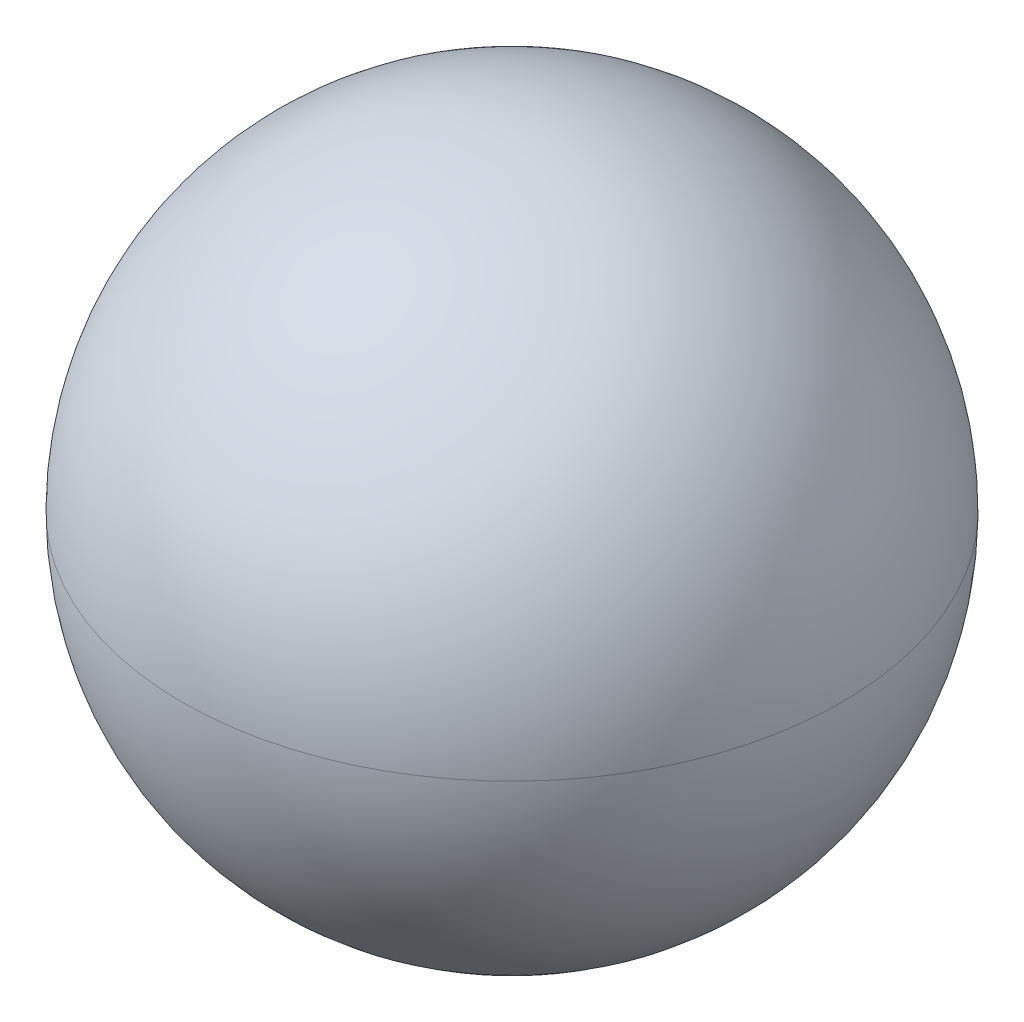
ISO-10303-21;
HEADER;
FILE_DESCRIPTION(('STEP AP214'),'2;1');
FILE_NAME('part.step','',(''),(''),'','','');
FILE_SCHEMA(('AUTOMOTIVE_DESIGN { 1 0 10303 214 1 1 1 1 }'));
ENDSEC;
DATA;
#1=APPLICATION_CONTEXT('core data for automotive mechanical design processes');
#2=APPLICATION_PROTOCOL_DEFINITION('international standard','automotive_design',2000,#1);
#3=PRODUCT_CONTEXT('',#1,'mechanical');
#4=PRODUCT('Part','Part','',(#3));
#5=PRODUCT_RELATED_PRODUCT_CATEGORY('part','',(#4));
#6=PRODUCT_DEFINITION_FORMATION('','',#4);
#7=PRODUCT_DEFINITION_CONTEXT('part definition',#1,'design');
#8=PRODUCT_DEFINITION('design','',#6,#7);
#9=PRODUCT_DEFINITION_SHAPE('','',#8);
#10=(LENGTH_UNIT() NAMED_UNIT(*) SI_UNIT(.MILLI.,.METRE.));
#11=(NAMED_UNIT(*) PLANE_ANGLE_UNIT() SI_UNIT($,.RADIAN.));
#12=(NAMED_UNIT(*) SI_UNIT($,.STERADIAN.) SOLID_ANGLE_UNIT());
#13=UNCERTAINTY_MEASURE_WITH_UNIT(LENGTH_MEASURE(1.E-05),#10,'distance_accuracy_value','');
#14=(GEOMETRIC_REPRESENTATION_CONTEXT(3) GLOBAL_UNCERTAINTY_ASSIGNED_CONTEXT((#13)) GLOBAL_UNIT_ASSIGNED_CONTEXT((#10,
#11,#12)) REPRESENTATION_CONTEXT('',''));
#15=CARTESIAN_POINT('',(0.,0.,0.));
#16=DIRECTION('',(0.,0.,1.));
#17=DIRECTION('',(1.,0.,0.));
#18=AXIS2_PLACEMENT_3D('',#15,#16,#17);
#19=CARTESIAN_POINT('',(0.,0.,0.));
#20=DIRECTION('',(0.,1.,0.));
#21=DIRECTION('',(0.,0.,1.));
#22=AXIS2_PLACEMENT_3D('',#19,#20,#21);
#23=PLANE('',#22);
#24=CARTESIAN_POINT('',(0.,0.,0.));
#25=DIRECTION('',(0.,1.,0.));
#26=DIRECTION('',(0.,0.,1.));
#27=AXIS2_PLACEMENT_3D('',#24,#25,#26);
#28=CIRCLE('',#27,6.13502705300133E-05);
#29=CARTESIAN_POINT('',(0.,0.,6.13502705300133E-05));
#30=VERTEX_POINT('',#29);
#31=EDGE_CURVE('E10',#30,#30,#28,.F.);
#32=ORIENTED_EDGE('',*,*,#31,.T.);
#33=EDGE_LOOP('',(#32));
#34=FACE_BOUND('',#33,.T.);
#35=ADVANCED_FACE('F31',(#34),#23,.F.);
#36=CARTESIAN_POINT('',(0.,3.24,0.));
#37=DIRECTION('',(0.,1.,0.));
#38=DIRECTION('',(0.,0.,1.));
#39=AXIS2_PLACEMENT_3D('',#36,#37,#38);
#40=SPHERICAL_SURFACE('',#39,3.26);
#41=CARTESIAN_POINT('',(0.,3.24,0.));
#42=DIRECTION('',(0.,-1.,0.));
#43=DIRECTION('',(0.,0.,-1.));
#44=AXIS2_PLACEMENT_3D('',#41,#42,#43);
#45=CIRCLE('',#44,3.26);
#46=CARTESIAN_POINT('',(0.,3.24,-3.26));
#47=VERTEX_POINT('',#46);
#48=EDGE_CURVE('E38',#47,#47,#45,.T.);
#49=ORIENTED_EDGE('',*,*,#48,.F.);
#50=EDGE_LOOP('',(#49));
#51=FACE_BOUND('',#50,.T.);
#52=ADVANCED_FACE('F45',(#51),#40,.T.);
#53=CARTESIAN_POINT('',(0.,3.26,0.));
#54=DIRECTION('',(0.,-1.,0.));
#55=DIRECTION('',(0.,0.,-1.));
#56=AXIS2_PLACEMENT_3D('',#53,#54,#55);
#57=DEGENERATE_TOROIDAL_SURFACE('',#56,6.13502705300133E-05,3.26,.T.);
#58=ORIENTED_EDGE('',*,*,#31,.F.);
#59=EDGE_LOOP('',(#58));
#60=FACE_BOUND('',#59,.T.);
#61=ORIENTED_EDGE('',*,*,#48,.T.);
#62=EDGE_LOOP('',(#61));
#63=FACE_BOUND('',#62,.T.);
#64=ADVANCED_FACE('F33',(#60,#63),#57,.T.);
#65=CLOSED_SHELL('',(#35,#52,#64));
#66=MANIFOLD_SOLID_BREP('B2',#65);
#67=ADVANCED_BREP_SHAPE_REPRESENTATION('',(#18,#66),#14);
#68=SHAPE_DEFINITION_REPRESENTATION(#9,#67);
ENDSEC;
END-ISO-10303-21;
